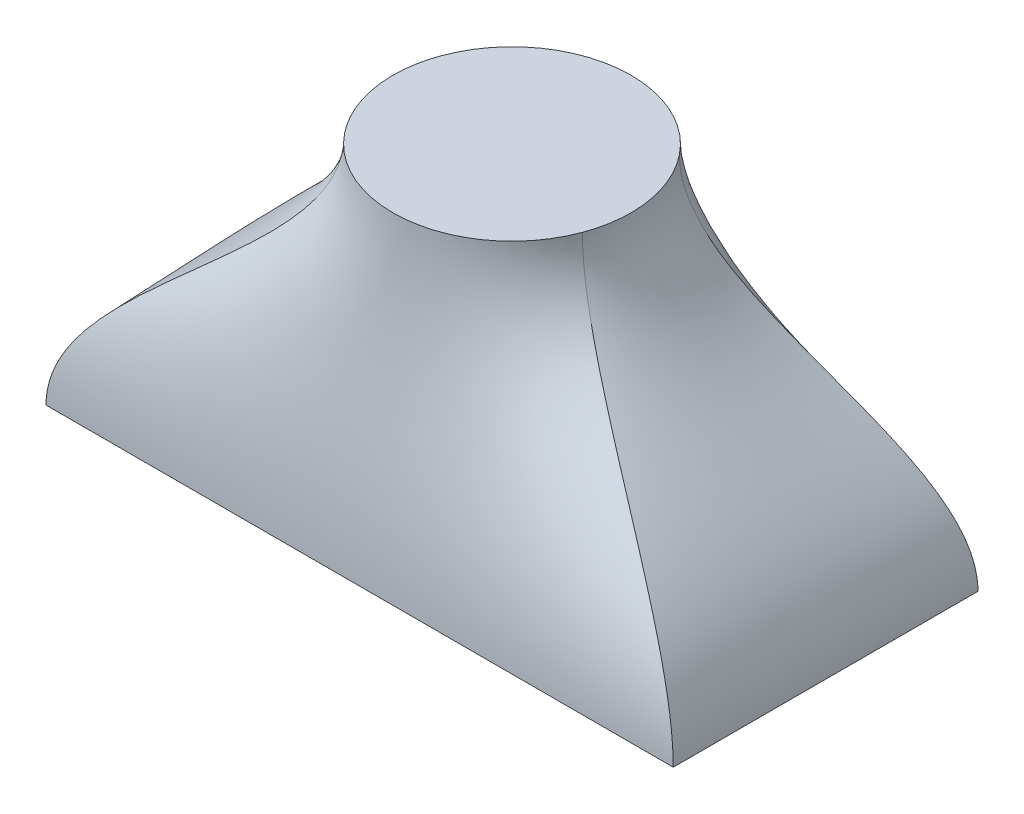
ISO-10303-21;
HEADER;
FILE_DESCRIPTION(('STEP AP214'),'2;1');
FILE_NAME('part.step','',(''),(''),'','','');
FILE_SCHEMA(('AUTOMOTIVE_DESIGN { 1 0 10303 214 1 1 1 1 }'));
ENDSEC;
DATA;
#1=APPLICATION_CONTEXT('core data for automotive mechanical design processes');
#2=APPLICATION_PROTOCOL_DEFINITION('international standard','automotive_design',2000,#1);
#3=PRODUCT_CONTEXT('',#1,'mechanical');
#4=PRODUCT('Part','Part','',(#3));
#5=PRODUCT_RELATED_PRODUCT_CATEGORY('part','',(#4));
#6=PRODUCT_DEFINITION_FORMATION('','',#4);
#7=PRODUCT_DEFINITION_CONTEXT('part definition',#1,'design');
#8=PRODUCT_DEFINITION('design','',#6,#7);
#9=PRODUCT_DEFINITION_SHAPE('','',#8);
#10=(LENGTH_UNIT() NAMED_UNIT(*) SI_UNIT(.MILLI.,.METRE.));
#11=(NAMED_UNIT(*) PLANE_ANGLE_UNIT() SI_UNIT($,.RADIAN.));
#12=(NAMED_UNIT(*) SI_UNIT($,.STERADIAN.) SOLID_ANGLE_UNIT());
#13=UNCERTAINTY_MEASURE_WITH_UNIT(LENGTH_MEASURE(1.E-05),#10,'distance_accuracy_value','');
#14=(GEOMETRIC_REPRESENTATION_CONTEXT(3) GLOBAL_UNCERTAINTY_ASSIGNED_CONTEXT((#13)) GLOBAL_UNIT_ASSIGNED_CONTEXT((#10,
#11,#12)) REPRESENTATION_CONTEXT('',''));
#15=CARTESIAN_POINT('',(0.,0.,0.));
#16=DIRECTION('',(0.,0.,1.));
#17=DIRECTION('',(1.,0.,0.));
#18=AXIS2_PLACEMENT_3D('',#15,#16,#17);
#19=CARTESIAN_POINT('',(-33.4141309853044,110.,26.6183990494114));
#20=CARTESIAN_POINT('',(-33.4141309853044,67.6662427394137,26.6183990494114));
#21=CARTESIAN_POINT('',(-112.478534700283,42.3337572605863,54.6454861884419));
#22=CARTESIAN_POINT('',(-112.478534700283,0.,54.6454861884419));
#23=CARTESIAN_POINT('',(-35.6927198805798,110.,23.7580817302871));
#24=CARTESIAN_POINT('',(-35.6927198805798,68.1022180272676,23.7580817302871));
#25=CARTESIAN_POINT('',(-112.478534700283,41.8977819727324,45.5379051570349));
#26=CARTESIAN_POINT('',(-112.478534700283,0.,45.5379051570349));
#27=CARTESIAN_POINT('',(-39.5115618987625,110.,17.4495252325747));
#28=CARTESIAN_POINT('',(-39.5115618987625,68.9741686029752,17.4495252325747));
#29=CARTESIAN_POINT('',(-112.478534700283,41.0258313970246,27.3227430942209));
#30=CARTESIAN_POINT('',(-112.478534700283,0.,27.3227430942209));
#31=CARTESIAN_POINT('',(-42.6475091130457,110.,6.84152563017722));
#32=CARTESIAN_POINT('',(-42.6475091130457,69.2901954615205,6.84152563017722));
#33=CARTESIAN_POINT('',(-112.478534700282,40.7098045384795,0.));
#34=CARTESIAN_POINT('',(-112.478534700282,0.,0.));
#35=CARTESIAN_POINT('',(-42.9870043339743,110.,-4.21508160216147));
#36=CARTESIAN_POINT('',(-42.9870043339743,69.0021832422731,-4.21508160216147));
#37=CARTESIAN_POINT('',(-112.478534700283,40.9978167577269,-27.3227430942209));
#38=CARTESIAN_POINT('',(-112.478534700283,0.,-27.3227430942209));
#39=CARTESIAN_POINT('',(-41.3330439517949,110.,-11.4015866288659));
#40=CARTESIAN_POINT('',(-41.3330439517949,68.2118616258598,-11.4015866288659));
#41=CARTESIAN_POINT('',(-112.478534700283,41.7881383741402,-45.5379051570349));
#42=CARTESIAN_POINT('',(-112.478534700283,0.,-45.5379051570349));
#43=CARTESIAN_POINT('',(-40.0634716555221,110.,-14.8311009828658));
#44=CARTESIAN_POINT('',(-40.0634716555221,67.8167008176532,-14.8311009828658));
#45=CARTESIAN_POINT('',(-112.478534700283,42.1832991823468,-54.6454861884419));
#46=CARTESIAN_POINT('',(-112.478534700283,0.,-54.6454861884419));
#47=B_SPLINE_SURFACE_WITH_KNOTS('',3,3,((#19,#20,#21,#22),(#23,#24,#25,#26),(#27,#28,#29,#30),
(#31,#32,#33,#34),(#35,#36,#37,#38),(#39,#40,#41,#42),(#43,#44,#45,#46)),.UNSPECIFIED.,.F.,.F.,
.F.,(4,1,1,1,4),(4,4),(0.,0.25,0.5,0.75,1.),(0.,1.),.UNSPECIFIED.);
#48=CARTESIAN_POINT('',(0.,110.,0.));
#49=DIRECTION('',(0.,-1.,0.));
#50=DIRECTION('',(0.,0.,1.));
#51=AXIS2_PLACEMENT_3D('',#48,#49,#50);
#52=CIRCLE('',#51,42.7205257160628);
#53=CARTESIAN_POINT('',(-33.4141309853044,110.,26.6183990494114));
#54=VERTEX_POINT('',#53);
#55=CARTESIAN_POINT('',(-40.0634716555221,110.,-14.8311009828658));
#56=VERTEX_POINT('',#55);
#57=EDGE_CURVE('E12',#54,#56,#52,.T.);
#58=CARTESIAN_POINT('',(-40.0634716555221,110.,-14.8311009828658));
#59=CARTESIAN_POINT('',(-40.0634716555221,67.8167008176532,-14.8311009828658));
#60=CARTESIAN_POINT('',(-112.478534700283,42.1832991823468,-54.6454861884419));
#61=CARTESIAN_POINT('',(-112.478534700283,0.,-54.6454861884419));
#62=B_SPLINE_CURVE_WITH_KNOTS('',3,(#58,#59,#60,#61),.UNSPECIFIED.,.F.,.F.,(4,4),(0.,1.),.UNSPECIFIED.);
#63=CARTESIAN_POINT('',(-112.478534700283,0.,-54.6454861884419));
#64=VERTEX_POINT('',#63);
#65=EDGE_CURVE('E132',#56,#64,#62,.T.);
#66=DIRECTION('',(0.,0.,-1.));
#67=VECTOR('',#66,1.);
#68=CARTESIAN_POINT('',(-112.478534700283,0.,0.));
#69=LINE('',#68,#67);
#70=CARTESIAN_POINT('',(-112.478534700283,0.,54.6454861884419));
#71=VERTEX_POINT('',#70);
#72=EDGE_CURVE('E182',#71,#64,#69,.T.);
#73=CARTESIAN_POINT('',(-33.4141309853044,110.,26.6183990494114));
#74=CARTESIAN_POINT('',(-33.4141309853044,67.6662427394137,26.6183990494114));
#75=CARTESIAN_POINT('',(-112.478534700283,42.3337572605863,54.6454861884419));
#76=CARTESIAN_POINT('',(-112.478534700283,0.,54.6454861884419));
#77=B_SPLINE_CURVE_WITH_KNOTS('',3,(#73,#74,#75,#76),.UNSPECIFIED.,.F.,.F.,(4,4),(0.,1.),.UNSPECIFIED.);
#78=EDGE_CURVE('E246',#54,#71,#77,.T.);
#79=ORIENTED_EDGE('',*,*,#57,.T.);
#80=ORIENTED_EDGE('',*,*,#65,.T.);
#81=ORIENTED_EDGE('',*,*,#72,.F.);
#82=ORIENTED_EDGE('',*,*,#78,.F.);
#83=EDGE_LOOP('',(#79,#80,#81,#82));
#84=FACE_BOUND('',#83,.T.);
#85=ADVANCED_FACE('F119',(#84),#47,.T.);
#86=CARTESIAN_POINT('',(-40.0634716555221,110.,-14.8311009828658));
#87=CARTESIAN_POINT('',(-40.0634716555221,67.8167008176532,-14.8311009828658));
#88=CARTESIAN_POINT('',(-112.478534700283,42.1832991823468,-54.6454861884419));
#89=CARTESIAN_POINT('',(-112.478534700283,0.,-54.6454861884419));
#90=CARTESIAN_POINT('',(-38.7568712248077,110.,-18.360639982128));
#91=CARTESIAN_POINT('',(-38.7568712248077,68.7725322969282,-18.360639982128));
#92=CARTESIAN_POINT('',(-103.105323475259,41.2274677030718,-54.6454861884419));
#93=CARTESIAN_POINT('',(-103.105323475259,0.,-54.6454861884419));
#94=CARTESIAN_POINT('',(-35.20598617711,110.,-25.0722759829679));
#95=CARTESIAN_POINT('',(-35.20598617711,70.6841952554782,-25.0722759829679));
#96=CARTESIAN_POINT('',(-84.3589010252119,39.3158047445218,-54.6454861884418));
#97=CARTESIAN_POINT('',(-84.3589010252119,0.,-54.6454861884418));
#98=CARTESIAN_POINT('',(-27.4335395272541,110.,-33.3984287800382));
#99=CARTESIAN_POINT('',(-27.4335395272541,72.2981639063823,-33.3984287800382));
#100=CARTESIAN_POINT('',(-56.2392673501413,37.7018360936177,-54.6454861884418));
#101=CARTESIAN_POINT('',(-56.2392673501413,0.,-54.6454861884418));
#102=CARTESIAN_POINT('',(-17.7564486664834,110.,-39.4052450752781));
#103=CARTESIAN_POINT('',(-17.7564486664834,73.1293077597302,-39.4052450752781));
#104=CARTESIAN_POINT('',(-28.1196336750706,36.8706922402699,-54.6454861884419));
#105=CARTESIAN_POINT('',(-28.1196336750706,0.,-54.6454861884419));
#106=CARTESIAN_POINT('',(-6.84600494733532,110.,-42.6754314990233));
#107=CARTESIAN_POINT('',(-6.84600494733532,73.2457159216232,-42.6754314990233));
#108=CARTESIAN_POINT('',(0.,36.7542840783768,-54.6454861884419));
#109=CARTESIAN_POINT('',(0.,0.,-54.6454861884419));
#110=CARTESIAN_POINT('',(4.53985917085644,110.,-42.982025166306));
#111=CARTESIAN_POINT('',(4.53985917085644,72.7952225535281,-42.982025166306));
#112=CARTESIAN_POINT('',(28.1196336750706,37.2047774464717,-54.6454861884419));
#113=CARTESIAN_POINT('',(28.1196336750707,0.,-54.6454861884419));
#114=CARTESIAN_POINT('',(15.6102508324627,110.,-40.3035259613387));
#115=CARTESIAN_POINT('',(15.6102508324627,71.7750744490389,-40.3035259613387));
#116=CARTESIAN_POINT('',(56.2392673501413,38.2249255509612,-54.6454861884418));
#117=CARTESIAN_POINT('',(56.2392673501413,0.,-54.6454861884418));
#118=CARTESIAN_POINT('',(25.5970371465932,110.,-34.8263144042675));
#119=CARTESIAN_POINT('',(25.5970371465932,70.1961004601373,-34.8263144042675));
#120=CARTESIAN_POINT('',(84.3589010252119,39.8038995398626,-54.6454861884418));
#121=CARTESIAN_POINT('',(84.3589010252119,0.,-54.6454861884418));
#122=CARTESIAN_POINT('',(31.0690851452774,110.,-29.5621399077459));
#123=CARTESIAN_POINT('',(31.0690851452774,68.5095286463216,-29.5621399077459));
#124=CARTESIAN_POINT('',(103.105323475259,41.4904713536784,-54.6454861884419));
#125=CARTESIAN_POINT('',(103.105323475259,0.,-54.6454861884419));
#126=CARTESIAN_POINT('',(33.4141309853044,110.,-26.6183990494114));
#127=CARTESIAN_POINT('',(33.4141309853044,67.6662427394137,-26.6183990494114));
#128=CARTESIAN_POINT('',(112.478534700283,42.3337572605863,-54.6454861884419));
#129=CARTESIAN_POINT('',(112.478534700283,0.,-54.6454861884419));
#130=B_SPLINE_SURFACE_WITH_KNOTS('',3,3,((#86,#87,#88,#89),(#90,#91,#92,#93),(#94,#95,#96,#97),
(#98,#99,#100,#101),(#102,#103,#104,#105),(#106,#107,#108,#109),(#110,#111,#112,#113),(#114,
#115,#116,#117),(#118,#119,#120,#121),(#122,#123,#124,#125),(#126,#127,#128,#129)),
.UNSPECIFIED.,.F.,.F.,.F.,(4,1,1,1,1,1,1,1,4),(4,4),(0.,0.125,0.25,0.375,0.5,0.625,0.75,0.875,
1.),(0.,1.),.UNSPECIFIED.);
#131=CARTESIAN_POINT('',(0.,110.,0.));
#132=DIRECTION('',(0.,-1.,0.));
#133=DIRECTION('',(0.,0.,1.));
#134=AXIS2_PLACEMENT_3D('',#131,#132,#133);
#135=CIRCLE('',#134,42.7205257160628);
#136=CARTESIAN_POINT('',(33.4141309853044,110.,-26.6183990494114));
#137=VERTEX_POINT('',#136);
#138=EDGE_CURVE('E141',#56,#137,#135,.T.);
#139=CARTESIAN_POINT('',(33.4141309853044,110.,-26.6183990494114));
#140=CARTESIAN_POINT('',(33.4141309853044,67.6662427394137,-26.6183990494114));
#141=CARTESIAN_POINT('',(112.478534700283,42.3337572605863,-54.6454861884419));
#142=CARTESIAN_POINT('',(112.478534700283,0.,-54.6454861884419));
#143=B_SPLINE_CURVE_WITH_KNOTS('',3,(#139,#140,#141,#142),.UNSPECIFIED.,.F.,.F.,(4,4),(0.,1.),.UNSPECIFIED.);
#144=CARTESIAN_POINT('',(112.478534700283,0.,-54.6454861884419));
#145=VERTEX_POINT('',#144);
#146=EDGE_CURVE('E167',#137,#145,#143,.T.);
#147=DIRECTION('',(1.,0.,0.));
#148=VECTOR('',#147,1.);
#149=CARTESIAN_POINT('',(0.,0.,-54.6454861884419));
#150=LINE('',#149,#148);
#151=EDGE_CURVE('E174',#64,#145,#150,.T.);
#152=ORIENTED_EDGE('',*,*,#138,.T.);
#153=ORIENTED_EDGE('',*,*,#146,.T.);
#154=ORIENTED_EDGE('',*,*,#151,.F.);
#155=ORIENTED_EDGE('',*,*,#65,.F.);
#156=EDGE_LOOP('',(#152,#153,#154,#155));
#157=FACE_BOUND('',#156,.T.);
#158=ADVANCED_FACE('F192',(#157),#130,.T.);
#159=CARTESIAN_POINT('',(33.4141309853044,110.,-26.6183990494114));
#160=CARTESIAN_POINT('',(33.4141309853044,67.6662427394137,-26.6183990494114));
#161=CARTESIAN_POINT('',(112.478534700283,42.3337572605863,-54.6454861884419));
#162=CARTESIAN_POINT('',(112.478534700283,0.,-54.6454861884419));
#163=CARTESIAN_POINT('',(35.6927198805798,110.,-23.7580817302871));
#164=CARTESIAN_POINT('',(35.6927198805798,68.1022180272676,-23.7580817302871));
#165=CARTESIAN_POINT('',(112.478534700283,41.8977819727324,-45.5379051570349));
#166=CARTESIAN_POINT('',(112.478534700283,0.,-45.5379051570349));
#167=CARTESIAN_POINT('',(39.5115618987626,110.,-17.4495252325747));
#168=CARTESIAN_POINT('',(39.5115618987626,68.9741686029752,-17.4495252325747));
#169=CARTESIAN_POINT('',(112.478534700283,41.0258313970247,-27.3227430942209));
#170=CARTESIAN_POINT('',(112.478534700283,0.,-27.3227430942209));
#171=CARTESIAN_POINT('',(42.6475091130457,110.,-6.84152563017723));
#172=CARTESIAN_POINT('',(42.6475091130457,69.2901954615205,-6.84152563017723));
#173=CARTESIAN_POINT('',(112.478534700282,40.7098045384795,0.));
#174=CARTESIAN_POINT('',(112.478534700282,0.,0.));
#175=CARTESIAN_POINT('',(42.9870043339744,110.,4.21508160216145));
#176=CARTESIAN_POINT('',(42.9870043339744,69.0021832422731,4.21508160216145));
#177=CARTESIAN_POINT('',(112.478534700283,40.9978167577269,27.3227430942209));
#178=CARTESIAN_POINT('',(112.478534700283,0.,27.3227430942209));
#179=CARTESIAN_POINT('',(41.3330439517949,110.,11.4015866288658));
#180=CARTESIAN_POINT('',(41.3330439517949,68.2118616258599,11.4015866288658));
#181=CARTESIAN_POINT('',(112.478534700283,41.7881383741402,45.5379051570349));
#182=CARTESIAN_POINT('',(112.478534700283,0.,45.5379051570349));
#183=CARTESIAN_POINT('',(40.0634716555221,110.,14.8311009828658));
#184=CARTESIAN_POINT('',(40.0634716555221,67.8167008176532,14.8311009828658));
#185=CARTESIAN_POINT('',(112.478534700283,42.1832991823468,54.6454861884419));
#186=CARTESIAN_POINT('',(112.478534700283,0.,54.6454861884419));
#187=B_SPLINE_SURFACE_WITH_KNOTS('',3,3,((#159,#160,#161,#162),(#163,#164,#165,#166),(#167,#168,
#169,#170),(#171,#172,#173,#174),(#175,#176,#177,#178),(#179,#180,#181,#182),(#183,#184,#185,
#186)),.UNSPECIFIED.,.F.,.F.,.F.,(4,1,1,1,4),(4,4),(0.,0.25,0.5,0.75,1.),(0.,1.),.UNSPECIFIED.);
#188=CARTESIAN_POINT('',(0.,110.,0.));
#189=DIRECTION('',(0.,-1.,0.));
#190=DIRECTION('',(0.,0.,1.));
#191=AXIS2_PLACEMENT_3D('',#188,#189,#190);
#192=CIRCLE('',#191,42.7205257160628);
#193=CARTESIAN_POINT('',(40.0634716555221,110.,14.8311009828658));
#194=VERTEX_POINT('',#193);
#195=EDGE_CURVE('E194',#137,#194,#192,.T.);
#196=CARTESIAN_POINT('',(40.0634716555221,110.,14.8311009828658));
#197=CARTESIAN_POINT('',(40.0634716555221,67.8167008176532,14.8311009828658));
#198=CARTESIAN_POINT('',(112.478534700283,42.1832991823468,54.6454861884419));
#199=CARTESIAN_POINT('',(112.478534700283,0.,54.6454861884419));
#200=B_SPLINE_CURVE_WITH_KNOTS('',3,(#196,#197,#198,#199),.UNSPECIFIED.,.F.,.F.,(4,4),(0.,1.),.UNSPECIFIED.);
#201=CARTESIAN_POINT('',(112.478534700283,0.,54.6454861884419));
#202=VERTEX_POINT('',#201);
#203=EDGE_CURVE('E170',#194,#202,#200,.T.);
#204=DIRECTION('',(0.,0.,1.));
#205=VECTOR('',#204,1.);
#206=CARTESIAN_POINT('',(112.478534700283,0.,0.));
#207=LINE('',#206,#205);
#208=EDGE_CURVE('E161',#145,#202,#207,.T.);
#209=ORIENTED_EDGE('',*,*,#195,.T.);
#210=ORIENTED_EDGE('',*,*,#203,.T.);
#211=ORIENTED_EDGE('',*,*,#208,.F.);
#212=ORIENTED_EDGE('',*,*,#146,.F.);
#213=EDGE_LOOP('',(#209,#210,#211,#212));
#214=FACE_BOUND('',#213,.T.);
#215=ADVANCED_FACE('F165',(#214),#187,.T.);
#216=CARTESIAN_POINT('',(40.0634716555221,110.,14.8311009828658));
#217=CARTESIAN_POINT('',(40.0634716555221,67.8167008176532,14.8311009828658));
#218=CARTESIAN_POINT('',(112.478534700283,42.1832991823468,54.6454861884419));
#219=CARTESIAN_POINT('',(112.478534700283,0.,54.6454861884419));
#220=CARTESIAN_POINT('',(38.7568712248077,110.,18.3606399821279));
#221=CARTESIAN_POINT('',(38.7568712248077,68.7725322969282,18.3606399821279));
#222=CARTESIAN_POINT('',(103.105323475259,41.2274677030718,54.6454861884419));
#223=CARTESIAN_POINT('',(103.105323475259,0.,54.6454861884419));
#224=CARTESIAN_POINT('',(35.20598617711,110.,25.0722759829679));
#225=CARTESIAN_POINT('',(35.20598617711,70.6841952554782,25.0722759829679));
#226=CARTESIAN_POINT('',(84.3589010252119,39.3158047445218,54.6454861884418));
#227=CARTESIAN_POINT('',(84.3589010252119,0.,54.6454861884418));
#228=CARTESIAN_POINT('',(27.4335395272542,110.,33.3984287800381));
#229=CARTESIAN_POINT('',(27.4335395272542,72.2981639063824,33.3984287800381));
#230=CARTESIAN_POINT('',(56.2392673501413,37.7018360936177,54.6454861884418));
#231=CARTESIAN_POINT('',(56.2392673501413,0.,54.6454861884418));
#232=CARTESIAN_POINT('',(17.7564486664835,110.,39.405245075278));
#233=CARTESIAN_POINT('',(17.7564486664835,73.12930775973,39.405245075278));
#234=CARTESIAN_POINT('',(28.1196336750706,36.8706922402698,54.6454861884419));
#235=CARTESIAN_POINT('',(28.1196336750706,0.,54.6454861884419));
#236=CARTESIAN_POINT('',(6.84600494733531,110.,42.6754314990233));
#237=CARTESIAN_POINT('',(6.84600494733531,73.2457159216234,42.6754314990233));
#238=CARTESIAN_POINT('',(0.,36.754284078377,54.6454861884419));
#239=CARTESIAN_POINT('',(0.,0.,54.6454861884419));
#240=CARTESIAN_POINT('',(-4.53985917085642,109.999999999999,42.982025166306));
#241=CARTESIAN_POINT('',(-4.53985917085642,72.7952225535279,42.982025166306));
#242=CARTESIAN_POINT('',(-28.1196336750706,37.2047774464716,54.6454861884419));
#243=CARTESIAN_POINT('',(-28.1196336750707,0.,54.6454861884419));
#244=CARTESIAN_POINT('',(-15.6102508324627,110.,40.3035259613387));
#245=CARTESIAN_POINT('',(-15.6102508324627,71.7750744490391,40.3035259613387));
#246=CARTESIAN_POINT('',(-56.2392673501413,38.2249255509613,54.6454861884418));
#247=CARTESIAN_POINT('',(-56.2392673501413,0.,54.6454861884418));
#248=CARTESIAN_POINT('',(-25.5970371465932,110.,34.8263144042675));
#249=CARTESIAN_POINT('',(-25.5970371465932,70.1961004601373,34.8263144042675));
#250=CARTESIAN_POINT('',(-84.3589010252119,39.8038995398626,54.6454861884418));
#251=CARTESIAN_POINT('',(-84.3589010252119,0.,54.6454861884418));
#252=CARTESIAN_POINT('',(-31.0690851452774,110.,29.5621399077459));
#253=CARTESIAN_POINT('',(-31.0690851452774,68.5095286463216,29.5621399077459));
#254=CARTESIAN_POINT('',(-103.105323475259,41.4904713536784,54.6454861884419));
#255=CARTESIAN_POINT('',(-103.105323475259,0.,54.6454861884419));
#256=CARTESIAN_POINT('',(-33.4141309853044,110.,26.6183990494114));
#257=CARTESIAN_POINT('',(-33.4141309853044,67.6662427394137,26.6183990494114));
#258=CARTESIAN_POINT('',(-112.478534700283,42.3337572605863,54.6454861884419));
#259=CARTESIAN_POINT('',(-112.478534700283,0.,54.6454861884419));
#260=B_SPLINE_SURFACE_WITH_KNOTS('',3,3,((#216,#217,#218,#219),(#220,#221,#222,#223),(#224,#225,
#226,#227),(#228,#229,#230,#231),(#232,#233,#234,#235),(#236,#237,#238,#239),(#240,#241,#242,
#243),(#244,#245,#246,#247),(#248,#249,#250,#251),(#252,#253,#254,#255),(#256,#257,#258,#259)),
.UNSPECIFIED.,.F.,.F.,.F.,(4,1,1,1,1,1,1,1,4),(4,4),(0.,0.125,0.25,0.375,0.5,0.625,0.75,0.875,
1.),(0.,1.),.UNSPECIFIED.);
#261=CARTESIAN_POINT('',(0.,110.,0.));
#262=DIRECTION('',(0.,1.,0.));
#263=DIRECTION('',(0.,0.,1.));
#264=AXIS2_PLACEMENT_3D('',#261,#262,#263);
#265=CIRCLE('',#264,42.7205257160628);
#266=EDGE_CURVE('E249',#194,#54,#265,.F.);
#267=DIRECTION('',(-1.,0.,0.));
#268=VECTOR('',#267,1.);
#269=CARTESIAN_POINT('',(0.,0.,54.6454861884419));
#270=LINE('',#269,#268);
#271=EDGE_CURVE('E175',#202,#71,#270,.T.);
#272=ORIENTED_EDGE('',*,*,#266,.T.);
#273=ORIENTED_EDGE('',*,*,#78,.T.);
#274=ORIENTED_EDGE('',*,*,#271,.F.);
#275=ORIENTED_EDGE('',*,*,#203,.F.);
#276=EDGE_LOOP('',(#272,#273,#274,#275));
#277=FACE_BOUND('',#276,.T.);
#278=ADVANCED_FACE('F329',(#277),#260,.T.);
#279=CARTESIAN_POINT('',(0.,110.,0.));
#280=DIRECTION('',(0.,-1.,0.));
#281=DIRECTION('',(0.,0.,-1.));
#282=AXIS2_PLACEMENT_3D('',#279,#280,#281);
#283=PLANE('',#282);
#284=ORIENTED_EDGE('',*,*,#266,.F.);
#285=ORIENTED_EDGE('',*,*,#195,.F.);
#286=ORIENTED_EDGE('',*,*,#138,.F.);
#287=ORIENTED_EDGE('',*,*,#57,.F.);
#288=EDGE_LOOP('',(#284,#285,#286,#287));
#289=FACE_BOUND('',#288,.T.);
#290=ADVANCED_FACE('F321',(#289),#283,.F.);
#291=CARTESIAN_POINT('',(0.,0.,0.));
#292=DIRECTION('',(0.,-1.,0.));
#293=DIRECTION('',(0.,0.,-1.));
#294=AXIS2_PLACEMENT_3D('',#291,#292,#293);
#295=PLANE('',#294);
#296=ORIENTED_EDGE('',*,*,#72,.T.);
#297=ORIENTED_EDGE('',*,*,#151,.T.);
#298=ORIENTED_EDGE('',*,*,#208,.T.);
#299=ORIENTED_EDGE('',*,*,#271,.T.);
#300=EDGE_LOOP('',(#296,#297,#298,#299));
#301=FACE_BOUND('',#300,.T.);
#302=ADVANCED_FACE('F121',(#301),#295,.T.);
#303=CLOSED_SHELL('',(#85,#158,#215,#278,#290,#302));
#304=MANIFOLD_SOLID_BREP('B2',#303);
#305=ADVANCED_BREP_SHAPE_REPRESENTATION('',(#18,#304),#14);
#306=SHAPE_DEFINITION_REPRESENTATION(#9,#305);
ENDSEC;
END-ISO-10303-21;
